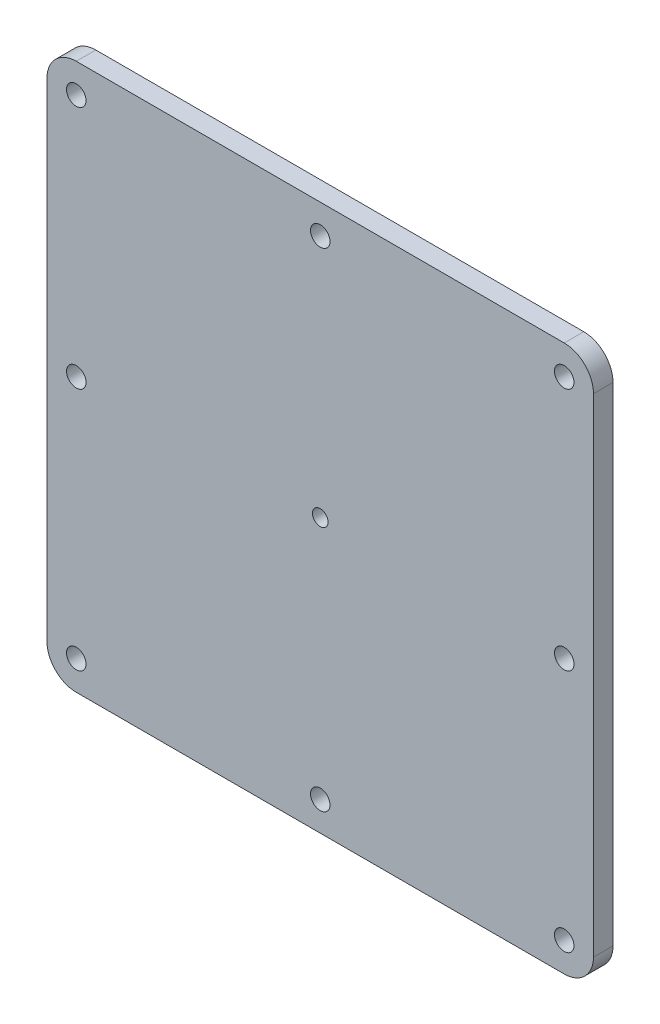
ISO-10303-21;
HEADER;
FILE_DESCRIPTION(('STEP AP214'),'2;1');
FILE_NAME('part.step','',(''),(''),'','','');
FILE_SCHEMA(('AUTOMOTIVE_DESIGN { 1 0 10303 214 1 1 1 1 }'));
ENDSEC;
DATA;
#1=APPLICATION_CONTEXT('core data for automotive mechanical design processes');
#2=APPLICATION_PROTOCOL_DEFINITION('international standard','automotive_design',2000,#1);
#3=PRODUCT_CONTEXT('',#1,'mechanical');
#4=PRODUCT('Part','Part','',(#3));
#5=PRODUCT_RELATED_PRODUCT_CATEGORY('part','',(#4));
#6=PRODUCT_DEFINITION_FORMATION('','',#4);
#7=PRODUCT_DEFINITION_CONTEXT('part definition',#1,'design');
#8=PRODUCT_DEFINITION('design','',#6,#7);
#9=PRODUCT_DEFINITION_SHAPE('','',#8);
#10=(LENGTH_UNIT() NAMED_UNIT(*) SI_UNIT(.MILLI.,.METRE.));
#11=(NAMED_UNIT(*) PLANE_ANGLE_UNIT() SI_UNIT($,.RADIAN.));
#12=(NAMED_UNIT(*) SI_UNIT($,.STERADIAN.) SOLID_ANGLE_UNIT());
#13=UNCERTAINTY_MEASURE_WITH_UNIT(LENGTH_MEASURE(1.E-05),#10,'distance_accuracy_value','');
#14=(GEOMETRIC_REPRESENTATION_CONTEXT(3) GLOBAL_UNCERTAINTY_ASSIGNED_CONTEXT((#13)) GLOBAL_UNIT_ASSIGNED_CONTEXT((#10,
#11,#12)) REPRESENTATION_CONTEXT('',''));
#15=CARTESIAN_POINT('',(0.,0.,0.));
#16=DIRECTION('',(0.,0.,1.));
#17=DIRECTION('',(1.,0.,0.));
#18=AXIS2_PLACEMENT_3D('',#15,#16,#17);
#19=CARTESIAN_POINT('',(-125.,-125.,10.));
#20=DIRECTION('',(0.,0.,1.));
#21=DIRECTION('',(1.,0.,0.));
#22=AXIS2_PLACEMENT_3D('',#19,#20,#21);
#23=PLANE('',#22);
#24=CARTESIAN_POINT('',(0.,-125.,10.));
#25=DIRECTION('',(0.,0.,1.));
#26=DIRECTION('',(1.,0.,0.));
#27=AXIS2_PLACEMENT_3D('',#24,#25,#26);
#28=CIRCLE('',#27,5.);
#29=CARTESIAN_POINT('',(5.,-125.,10.));
#30=VERTEX_POINT('',#29);
#31=EDGE_CURVE('E218',#30,#30,#28,.T.);
#32=ORIENTED_EDGE('',*,*,#31,.F.);
#33=EDGE_LOOP('',(#32));
#34=FACE_BOUND('',#33,.T.);
#35=CARTESIAN_POINT('',(0.,0.,10.));
#36=DIRECTION('',(0.,0.,1.));
#37=DIRECTION('',(1.,0.,0.));
#38=AXIS2_PLACEMENT_3D('',#35,#36,#37);
#39=CIRCLE('',#38,4.);
#40=CARTESIAN_POINT('',(4.,0.,10.));
#41=VERTEX_POINT('',#40);
#42=EDGE_CURVE('E206',#41,#41,#39,.T.);
#43=ORIENTED_EDGE('',*,*,#42,.F.);
#44=EDGE_LOOP('',(#43));
#45=FACE_BOUND('',#44,.T.);
#46=CARTESIAN_POINT('',(125.,0.,10.));
#47=DIRECTION('',(0.,0.,1.));
#48=DIRECTION('',(1.,0.,0.));
#49=AXIS2_PLACEMENT_3D('',#46,#47,#48);
#50=CIRCLE('',#49,5.00000000000001);
#51=CARTESIAN_POINT('',(130.,0.,10.));
#52=VERTEX_POINT('',#51);
#53=EDGE_CURVE('E194',#52,#52,#50,.T.);
#54=ORIENTED_EDGE('',*,*,#53,.F.);
#55=EDGE_LOOP('',(#54));
#56=FACE_BOUND('',#55,.T.);
#57=CARTESIAN_POINT('',(0.,125.,10.));
#58=DIRECTION('',(0.,0.,1.));
#59=DIRECTION('',(1.,0.,0.));
#60=AXIS2_PLACEMENT_3D('',#57,#58,#59);
#61=CIRCLE('',#60,5.);
#62=CARTESIAN_POINT('',(4.99999999999999,125.,10.));
#63=VERTEX_POINT('',#62);
#64=EDGE_CURVE('E182',#63,#63,#61,.T.);
#65=ORIENTED_EDGE('',*,*,#64,.F.);
#66=EDGE_LOOP('',(#65));
#67=FACE_BOUND('',#66,.T.);
#68=CARTESIAN_POINT('',(-125.,-125.,10.));
#69=DIRECTION('',(0.,0.,1.));
#70=DIRECTION('',(1.,0.,0.));
#71=AXIS2_PLACEMENT_3D('',#68,#69,#70);
#72=CIRCLE('',#71,15.);
#73=CARTESIAN_POINT('',(-140.,-125.,10.));
#74=VERTEX_POINT('',#73);
#75=CARTESIAN_POINT('',(-125.,-140.,10.));
#76=VERTEX_POINT('',#75);
#77=EDGE_CURVE('E145',#74,#76,#72,.T.);
#78=ORIENTED_EDGE('',*,*,#77,.T.);
#79=DIRECTION('',(1.,0.,0.));
#80=VECTOR('',#79,1.);
#81=CARTESIAN_POINT('',(-125.,-140.,10.));
#82=LINE('',#81,#80);
#83=CARTESIAN_POINT('',(125.,-140.,10.));
#84=VERTEX_POINT('',#83);
#85=EDGE_CURVE('E93',#76,#84,#82,.T.);
#86=ORIENTED_EDGE('',*,*,#85,.T.);
#87=CARTESIAN_POINT('',(125.,-125.,10.));
#88=DIRECTION('',(0.,0.,1.));
#89=DIRECTION('',(1.,0.,0.));
#90=AXIS2_PLACEMENT_3D('',#87,#88,#89);
#91=CIRCLE('',#90,15.);
#92=CARTESIAN_POINT('',(140.,-125.,10.));
#93=VERTEX_POINT('',#92);
#94=EDGE_CURVE('E160',#84,#93,#91,.T.);
#95=ORIENTED_EDGE('',*,*,#94,.T.);
#96=DIRECTION('',(0.,1.,0.));
#97=VECTOR('',#96,1.);
#98=CARTESIAN_POINT('',(140.,125.,10.));
#99=LINE('',#98,#97);
#100=CARTESIAN_POINT('',(140.,125.,10.));
#101=VERTEX_POINT('',#100);
#102=EDGE_CURVE('E173',#93,#101,#99,.T.);
#103=ORIENTED_EDGE('',*,*,#102,.T.);
#104=CARTESIAN_POINT('',(125.,125.,10.));
#105=DIRECTION('',(0.,0.,1.));
#106=DIRECTION('',(-1.,0.,0.));
#107=AXIS2_PLACEMENT_3D('',#104,#105,#106);
#108=CIRCLE('',#107,15.);
#109=CARTESIAN_POINT('',(125.,140.,10.));
#110=VERTEX_POINT('',#109);
#111=EDGE_CURVE('E112',#101,#110,#108,.T.);
#112=ORIENTED_EDGE('',*,*,#111,.T.);
#113=DIRECTION('',(-1.,0.,0.));
#114=VECTOR('',#113,1.);
#115=CARTESIAN_POINT('',(-125.,140.,10.));
#116=LINE('',#115,#114);
#117=CARTESIAN_POINT('',(-125.,140.,10.));
#118=VERTEX_POINT('',#117);
#119=EDGE_CURVE('E106',#110,#118,#116,.T.);
#120=ORIENTED_EDGE('',*,*,#119,.T.);
#121=CARTESIAN_POINT('',(-125.,125.,10.));
#122=DIRECTION('',(0.,0.,1.));
#123=DIRECTION('',(1.,0.,0.));
#124=AXIS2_PLACEMENT_3D('',#121,#122,#123);
#125=CIRCLE('',#124,15.);
#126=CARTESIAN_POINT('',(-140.,125.,10.));
#127=VERTEX_POINT('',#126);
#128=EDGE_CURVE('E110',#118,#127,#125,.T.);
#129=ORIENTED_EDGE('',*,*,#128,.T.);
#130=DIRECTION('',(0.,-1.,0.));
#131=VECTOR('',#130,1.);
#132=CARTESIAN_POINT('',(-140.,125.,10.));
#133=LINE('',#132,#131);
#134=EDGE_CURVE('E50',#127,#74,#133,.T.);
#135=ORIENTED_EDGE('',*,*,#134,.T.);
#136=EDGE_LOOP('',(#78,#86,#95,#103,#112,#120,#129,#135));
#137=FACE_BOUND('',#136,.T.);
#138=CARTESIAN_POINT('',(-125.,125.,10.));
#139=DIRECTION('',(0.,0.,1.));
#140=DIRECTION('',(1.,0.,0.));
#141=AXIS2_PLACEMENT_3D('',#138,#139,#140);
#142=CIRCLE('',#141,5.00000000000001);
#143=CARTESIAN_POINT('',(-120.,125.,10.));
#144=VERTEX_POINT('',#143);
#145=EDGE_CURVE('E134',#144,#144,#142,.T.);
#146=ORIENTED_EDGE('',*,*,#145,.F.);
#147=EDGE_LOOP('',(#146));
#148=FACE_BOUND('',#147,.T.);
#149=CARTESIAN_POINT('',(125.,125.,10.));
#150=DIRECTION('',(0.,0.,1.));
#151=DIRECTION('',(1.,0.,0.));
#152=AXIS2_PLACEMENT_3D('',#149,#150,#151);
#153=CIRCLE('',#152,4.99999999999999);
#154=CARTESIAN_POINT('',(130.,125.,10.));
#155=VERTEX_POINT('',#154);
#156=EDGE_CURVE('E188',#155,#155,#153,.T.);
#157=ORIENTED_EDGE('',*,*,#156,.F.);
#158=EDGE_LOOP('',(#157));
#159=FACE_BOUND('',#158,.T.);
#160=CARTESIAN_POINT('',(-125.,0.,10.));
#161=DIRECTION('',(0.,0.,1.));
#162=DIRECTION('',(1.,0.,0.));
#163=AXIS2_PLACEMENT_3D('',#160,#161,#162);
#164=CIRCLE('',#163,5.);
#165=CARTESIAN_POINT('',(-120.,0.,10.));
#166=VERTEX_POINT('',#165);
#167=EDGE_CURVE('E200',#166,#166,#164,.T.);
#168=ORIENTED_EDGE('',*,*,#167,.F.);
#169=EDGE_LOOP('',(#168));
#170=FACE_BOUND('',#169,.T.);
#171=CARTESIAN_POINT('',(-125.,-125.,10.));
#172=DIRECTION('',(0.,0.,1.));
#173=DIRECTION('',(1.,0.,0.));
#174=AXIS2_PLACEMENT_3D('',#171,#172,#173);
#175=CIRCLE('',#174,5.00000000000001);
#176=CARTESIAN_POINT('',(-120.,-125.,10.));
#177=VERTEX_POINT('',#176);
#178=EDGE_CURVE('E212',#177,#177,#175,.T.);
#179=ORIENTED_EDGE('',*,*,#178,.F.);
#180=EDGE_LOOP('',(#179));
#181=FACE_BOUND('',#180,.T.);
#182=CARTESIAN_POINT('',(125.,-125.,10.));
#183=DIRECTION('',(0.,0.,1.));
#184=DIRECTION('',(1.,0.,0.));
#185=AXIS2_PLACEMENT_3D('',#182,#183,#184);
#186=CIRCLE('',#185,5.00000000000002);
#187=CARTESIAN_POINT('',(130.,-125.,10.));
#188=VERTEX_POINT('',#187);
#189=EDGE_CURVE('E224',#188,#188,#186,.T.);
#190=ORIENTED_EDGE('',*,*,#189,.F.);
#191=EDGE_LOOP('',(#190));
#192=FACE_BOUND('',#191,.T.);
#193=ADVANCED_FACE('F33',(#34,#45,#56,#67,#137,#148,#159,#170,#181,#192),#23,.T.);
#194=CARTESIAN_POINT('',(-125.,-125.,0.));
#195=DIRECTION('',(0.,0.,1.));
#196=DIRECTION('',(1.,0.,0.));
#197=AXIS2_PLACEMENT_3D('',#194,#195,#196);
#198=PLANE('',#197);
#199=CARTESIAN_POINT('',(-125.,-125.,0.));
#200=DIRECTION('',(0.,0.,1.));
#201=DIRECTION('',(1.,0.,0.));
#202=AXIS2_PLACEMENT_3D('',#199,#200,#201);
#203=CIRCLE('',#202,15.);
#204=CARTESIAN_POINT('',(-140.,-125.,0.));
#205=VERTEX_POINT('',#204);
#206=CARTESIAN_POINT('',(-125.,-140.,0.));
#207=VERTEX_POINT('',#206);
#208=EDGE_CURVE('E130',#205,#207,#203,.T.);
#209=ORIENTED_EDGE('',*,*,#208,.F.);
#210=DIRECTION('',(0.,-1.,0.));
#211=VECTOR('',#210,1.);
#212=CARTESIAN_POINT('',(-140.,125.,0.));
#213=LINE('',#212,#211);
#214=CARTESIAN_POINT('',(-140.,125.,0.));
#215=VERTEX_POINT('',#214);
#216=EDGE_CURVE('E85',#215,#205,#213,.T.);
#217=ORIENTED_EDGE('',*,*,#216,.F.);
#218=CARTESIAN_POINT('',(-125.,125.,0.));
#219=DIRECTION('',(0.,0.,1.));
#220=DIRECTION('',(1.,0.,0.));
#221=AXIS2_PLACEMENT_3D('',#218,#219,#220);
#222=CIRCLE('',#221,15.);
#223=CARTESIAN_POINT('',(-125.,140.,0.));
#224=VERTEX_POINT('',#223);
#225=EDGE_CURVE('E79',#224,#215,#222,.T.);
#226=ORIENTED_EDGE('',*,*,#225,.F.);
#227=DIRECTION('',(-1.,0.,0.));
#228=VECTOR('',#227,1.);
#229=CARTESIAN_POINT('',(-125.,140.,0.));
#230=LINE('',#229,#228);
#231=CARTESIAN_POINT('',(125.,140.,0.));
#232=VERTEX_POINT('',#231);
#233=EDGE_CURVE('E120',#232,#224,#230,.T.);
#234=ORIENTED_EDGE('',*,*,#233,.F.);
#235=CARTESIAN_POINT('',(125.,125.,0.));
#236=DIRECTION('',(0.,0.,1.));
#237=DIRECTION('',(-1.,0.,0.));
#238=AXIS2_PLACEMENT_3D('',#235,#236,#237);
#239=CIRCLE('',#238,15.);
#240=CARTESIAN_POINT('',(140.,125.,0.));
#241=VERTEX_POINT('',#240);
#242=EDGE_CURVE('E140',#241,#232,#239,.T.);
#243=ORIENTED_EDGE('',*,*,#242,.F.);
#244=DIRECTION('',(0.,1.,0.));
#245=VECTOR('',#244,1.);
#246=CARTESIAN_POINT('',(140.,125.,0.));
#247=LINE('',#246,#245);
#248=CARTESIAN_POINT('',(140.,-125.,0.));
#249=VERTEX_POINT('',#248);
#250=EDGE_CURVE('E138',#249,#241,#247,.T.);
#251=ORIENTED_EDGE('',*,*,#250,.F.);
#252=CARTESIAN_POINT('',(125.,-125.,0.));
#253=DIRECTION('',(0.,0.,1.));
#254=DIRECTION('',(1.,0.,0.));
#255=AXIS2_PLACEMENT_3D('',#252,#253,#254);
#256=CIRCLE('',#255,15.);
#257=CARTESIAN_POINT('',(125.,-140.,0.));
#258=VERTEX_POINT('',#257);
#259=EDGE_CURVE('E136',#258,#249,#256,.T.);
#260=ORIENTED_EDGE('',*,*,#259,.F.);
#261=DIRECTION('',(1.,0.,0.));
#262=VECTOR('',#261,1.);
#263=CARTESIAN_POINT('',(-125.,-140.,0.));
#264=LINE('',#263,#262);
#265=EDGE_CURVE('E133',#207,#258,#264,.T.);
#266=ORIENTED_EDGE('',*,*,#265,.F.);
#267=EDGE_LOOP('',(#209,#217,#226,#234,#243,#251,#260,#266));
#268=FACE_BOUND('',#267,.T.);
#269=CARTESIAN_POINT('',(-125.,125.,0.));
#270=DIRECTION('',(0.,0.,1.));
#271=DIRECTION('',(1.,0.,0.));
#272=AXIS2_PLACEMENT_3D('',#269,#270,#271);
#273=CIRCLE('',#272,5.00000000000001);
#274=CARTESIAN_POINT('',(-120.,125.,0.));
#275=VERTEX_POINT('',#274);
#276=EDGE_CURVE('E179',#275,#275,#273,.T.);
#277=ORIENTED_EDGE('',*,*,#276,.T.);
#278=EDGE_LOOP('',(#277));
#279=FACE_BOUND('',#278,.T.);
#280=CARTESIAN_POINT('',(0.,125.,0.));
#281=DIRECTION('',(0.,0.,1.));
#282=DIRECTION('',(1.,0.,0.));
#283=AXIS2_PLACEMENT_3D('',#280,#281,#282);
#284=CIRCLE('',#283,5.);
#285=CARTESIAN_POINT('',(4.99999999999999,125.,0.));
#286=VERTEX_POINT('',#285);
#287=EDGE_CURVE('E185',#286,#286,#284,.T.);
#288=ORIENTED_EDGE('',*,*,#287,.T.);
#289=EDGE_LOOP('',(#288));
#290=FACE_BOUND('',#289,.T.);
#291=CARTESIAN_POINT('',(125.,125.,0.));
#292=DIRECTION('',(0.,0.,1.));
#293=DIRECTION('',(1.,0.,0.));
#294=AXIS2_PLACEMENT_3D('',#291,#292,#293);
#295=CIRCLE('',#294,4.99999999999999);
#296=CARTESIAN_POINT('',(130.,125.,0.));
#297=VERTEX_POINT('',#296);
#298=EDGE_CURVE('E191',#297,#297,#295,.T.);
#299=ORIENTED_EDGE('',*,*,#298,.T.);
#300=EDGE_LOOP('',(#299));
#301=FACE_BOUND('',#300,.T.);
#302=CARTESIAN_POINT('',(125.,0.,0.));
#303=DIRECTION('',(0.,0.,1.));
#304=DIRECTION('',(1.,0.,0.));
#305=AXIS2_PLACEMENT_3D('',#302,#303,#304);
#306=CIRCLE('',#305,5.00000000000001);
#307=CARTESIAN_POINT('',(130.,0.,0.));
#308=VERTEX_POINT('',#307);
#309=EDGE_CURVE('E197',#308,#308,#306,.T.);
#310=ORIENTED_EDGE('',*,*,#309,.T.);
#311=EDGE_LOOP('',(#310));
#312=FACE_BOUND('',#311,.T.);
#313=CARTESIAN_POINT('',(-125.,0.,0.));
#314=DIRECTION('',(0.,0.,1.));
#315=DIRECTION('',(1.,0.,0.));
#316=AXIS2_PLACEMENT_3D('',#313,#314,#315);
#317=CIRCLE('',#316,5.);
#318=CARTESIAN_POINT('',(-120.,0.,0.));
#319=VERTEX_POINT('',#318);
#320=EDGE_CURVE('E203',#319,#319,#317,.T.);
#321=ORIENTED_EDGE('',*,*,#320,.T.);
#322=EDGE_LOOP('',(#321));
#323=FACE_BOUND('',#322,.T.);
#324=CARTESIAN_POINT('',(0.,0.,0.));
#325=DIRECTION('',(0.,0.,1.));
#326=DIRECTION('',(1.,0.,0.));
#327=AXIS2_PLACEMENT_3D('',#324,#325,#326);
#328=CIRCLE('',#327,4.);
#329=CARTESIAN_POINT('',(4.,0.,0.));
#330=VERTEX_POINT('',#329);
#331=EDGE_CURVE('E209',#330,#330,#328,.T.);
#332=ORIENTED_EDGE('',*,*,#331,.T.);
#333=EDGE_LOOP('',(#332));
#334=FACE_BOUND('',#333,.T.);
#335=CARTESIAN_POINT('',(-125.,-125.,0.));
#336=DIRECTION('',(0.,0.,1.));
#337=DIRECTION('',(1.,0.,0.));
#338=AXIS2_PLACEMENT_3D('',#335,#336,#337);
#339=CIRCLE('',#338,5.00000000000001);
#340=CARTESIAN_POINT('',(-120.,-125.,0.));
#341=VERTEX_POINT('',#340);
#342=EDGE_CURVE('E215',#341,#341,#339,.T.);
#343=ORIENTED_EDGE('',*,*,#342,.T.);
#344=EDGE_LOOP('',(#343));
#345=FACE_BOUND('',#344,.T.);
#346=CARTESIAN_POINT('',(0.,-125.,0.));
#347=DIRECTION('',(0.,0.,1.));
#348=DIRECTION('',(1.,0.,0.));
#349=AXIS2_PLACEMENT_3D('',#346,#347,#348);
#350=CIRCLE('',#349,5.);
#351=CARTESIAN_POINT('',(5.,-125.,0.));
#352=VERTEX_POINT('',#351);
#353=EDGE_CURVE('E221',#352,#352,#350,.T.);
#354=ORIENTED_EDGE('',*,*,#353,.T.);
#355=EDGE_LOOP('',(#354));
#356=FACE_BOUND('',#355,.T.);
#357=CARTESIAN_POINT('',(125.,-125.,0.));
#358=DIRECTION('',(0.,0.,1.));
#359=DIRECTION('',(1.,0.,0.));
#360=AXIS2_PLACEMENT_3D('',#357,#358,#359);
#361=CIRCLE('',#360,5.00000000000002);
#362=CARTESIAN_POINT('',(130.,-125.,0.));
#363=VERTEX_POINT('',#362);
#364=EDGE_CURVE('E227',#363,#363,#361,.T.);
#365=ORIENTED_EDGE('',*,*,#364,.T.);
#366=EDGE_LOOP('',(#365));
#367=FACE_BOUND('',#366,.T.);
#368=ADVANCED_FACE('F164',(#268,#279,#290,#301,#312,#323,#334,#345,#356,#367),#198,.F.);
#369=CARTESIAN_POINT('',(-125.,-125.,10.));
#370=DIRECTION('',(0.,0.,-1.));
#371=DIRECTION('',(-1.,0.,0.));
#372=AXIS2_PLACEMENT_3D('',#369,#370,#371);
#373=CYLINDRICAL_SURFACE('',#372,15.);
#374=ORIENTED_EDGE('',*,*,#208,.T.);
#375=DIRECTION('',(0.,0.,-1.));
#376=VECTOR('',#375,1.);
#377=CARTESIAN_POINT('',(-125.,-140.,10.));
#378=LINE('',#377,#376);
#379=EDGE_CURVE('E11',#76,#207,#378,.T.);
#380=ORIENTED_EDGE('',*,*,#379,.F.);
#381=ORIENTED_EDGE('',*,*,#77,.F.);
#382=DIRECTION('',(0.,0.,-1.));
#383=VECTOR('',#382,1.);
#384=CARTESIAN_POINT('',(-140.,-125.,10.));
#385=LINE('',#384,#383);
#386=EDGE_CURVE('E126',#74,#205,#385,.T.);
#387=ORIENTED_EDGE('',*,*,#386,.T.);
#388=EDGE_LOOP('',(#374,#380,#381,#387));
#389=FACE_BOUND('',#388,.T.);
#390=ADVANCED_FACE('F35',(#389),#373,.T.);
#391=CARTESIAN_POINT('',(-125.,-140.,10.));
#392=DIRECTION('',(0.,1.,0.));
#393=DIRECTION('',(0.,0.,1.));
#394=AXIS2_PLACEMENT_3D('',#391,#392,#393);
#395=PLANE('',#394);
#396=ORIENTED_EDGE('',*,*,#265,.T.);
#397=DIRECTION('',(0.,0.,-1.));
#398=VECTOR('',#397,1.);
#399=CARTESIAN_POINT('',(125.,-140.,10.));
#400=LINE('',#399,#398);
#401=EDGE_CURVE('E42',#84,#258,#400,.T.);
#402=ORIENTED_EDGE('',*,*,#401,.F.);
#403=ORIENTED_EDGE('',*,*,#85,.F.);
#404=ORIENTED_EDGE('',*,*,#379,.T.);
#405=EDGE_LOOP('',(#396,#402,#403,#404));
#406=FACE_BOUND('',#405,.T.);
#407=ADVANCED_FACE('F261',(#406),#395,.F.);
#408=CARTESIAN_POINT('',(125.,-125.,10.));
#409=DIRECTION('',(0.,0.,-1.));
#410=DIRECTION('',(-1.,0.,0.));
#411=AXIS2_PLACEMENT_3D('',#408,#409,#410);
#412=CYLINDRICAL_SURFACE('',#411,15.);
#413=ORIENTED_EDGE('',*,*,#259,.T.);
#414=DIRECTION('',(0.,0.,-1.));
#415=VECTOR('',#414,1.);
#416=CARTESIAN_POINT('',(140.,-125.,10.));
#417=LINE('',#416,#415);
#418=EDGE_CURVE('E152',#93,#249,#417,.T.);
#419=ORIENTED_EDGE('',*,*,#418,.F.);
#420=ORIENTED_EDGE('',*,*,#94,.F.);
#421=ORIENTED_EDGE('',*,*,#401,.T.);
#422=EDGE_LOOP('',(#413,#419,#420,#421));
#423=FACE_BOUND('',#422,.T.);
#424=ADVANCED_FACE('F158',(#423),#412,.T.);
#425=CARTESIAN_POINT('',(140.,125.,10.));
#426=DIRECTION('',(-1.,0.,0.));
#427=DIRECTION('',(0.,0.,1.));
#428=AXIS2_PLACEMENT_3D('',#425,#426,#427);
#429=PLANE('',#428);
#430=ORIENTED_EDGE('',*,*,#250,.T.);
#431=DIRECTION('',(0.,0.,-1.));
#432=VECTOR('',#431,1.);
#433=CARTESIAN_POINT('',(140.,125.,10.));
#434=LINE('',#433,#432);
#435=EDGE_CURVE('E149',#101,#241,#434,.T.);
#436=ORIENTED_EDGE('',*,*,#435,.F.);
#437=ORIENTED_EDGE('',*,*,#102,.F.);
#438=ORIENTED_EDGE('',*,*,#418,.T.);
#439=EDGE_LOOP('',(#430,#436,#437,#438));
#440=FACE_BOUND('',#439,.T.);
#441=ADVANCED_FACE('F169',(#440),#429,.F.);
#442=CARTESIAN_POINT('',(125.,125.,10.));
#443=DIRECTION('',(0.,0.,-1.));
#444=DIRECTION('',(-1.,0.,0.));
#445=AXIS2_PLACEMENT_3D('',#442,#443,#444);
#446=CYLINDRICAL_SURFACE('',#445,15.);
#447=ORIENTED_EDGE('',*,*,#242,.T.);
#448=DIRECTION('',(0.,0.,-1.));
#449=VECTOR('',#448,1.);
#450=CARTESIAN_POINT('',(125.,140.,10.));
#451=LINE('',#450,#449);
#452=EDGE_CURVE('E121',#110,#232,#451,.T.);
#453=ORIENTED_EDGE('',*,*,#452,.F.);
#454=ORIENTED_EDGE('',*,*,#111,.F.);
#455=ORIENTED_EDGE('',*,*,#435,.T.);
#456=EDGE_LOOP('',(#447,#453,#454,#455));
#457=FACE_BOUND('',#456,.T.);
#458=ADVANCED_FACE('F172',(#457),#446,.T.);
#459=CARTESIAN_POINT('',(-125.,140.,10.));
#460=DIRECTION('',(0.,-1.,0.));
#461=DIRECTION('',(0.,0.,-1.));
#462=AXIS2_PLACEMENT_3D('',#459,#460,#461);
#463=PLANE('',#462);
#464=ORIENTED_EDGE('',*,*,#233,.T.);
#465=DIRECTION('',(0.,0.,-1.));
#466=VECTOR('',#465,1.);
#467=CARTESIAN_POINT('',(-125.,140.,10.));
#468=LINE('',#467,#466);
#469=EDGE_CURVE('E117',#118,#224,#468,.T.);
#470=ORIENTED_EDGE('',*,*,#469,.F.);
#471=ORIENTED_EDGE('',*,*,#119,.F.);
#472=ORIENTED_EDGE('',*,*,#452,.T.);
#473=EDGE_LOOP('',(#464,#470,#471,#472));
#474=FACE_BOUND('',#473,.T.);
#475=ADVANCED_FACE('F118',(#474),#463,.F.);
#476=CARTESIAN_POINT('',(-125.,125.,10.));
#477=DIRECTION('',(0.,0.,-1.));
#478=DIRECTION('',(-1.,0.,0.));
#479=AXIS2_PLACEMENT_3D('',#476,#477,#478);
#480=CYLINDRICAL_SURFACE('',#479,15.);
#481=ORIENTED_EDGE('',*,*,#225,.T.);
#482=DIRECTION('',(0.,0.,-1.));
#483=VECTOR('',#482,1.);
#484=CARTESIAN_POINT('',(-140.,125.,10.));
#485=LINE('',#484,#483);
#486=EDGE_CURVE('E122',#127,#215,#485,.T.);
#487=ORIENTED_EDGE('',*,*,#486,.F.);
#488=ORIENTED_EDGE('',*,*,#128,.F.);
#489=ORIENTED_EDGE('',*,*,#469,.T.);
#490=EDGE_LOOP('',(#481,#487,#488,#489));
#491=FACE_BOUND('',#490,.T.);
#492=ADVANCED_FACE('F124',(#491),#480,.T.);
#493=CARTESIAN_POINT('',(-140.,125.,10.));
#494=DIRECTION('',(1.,0.,0.));
#495=DIRECTION('',(0.,0.,-1.));
#496=AXIS2_PLACEMENT_3D('',#493,#494,#495);
#497=PLANE('',#496);
#498=ORIENTED_EDGE('',*,*,#216,.T.);
#499=ORIENTED_EDGE('',*,*,#386,.F.);
#500=ORIENTED_EDGE('',*,*,#134,.F.);
#501=ORIENTED_EDGE('',*,*,#486,.T.);
#502=EDGE_LOOP('',(#498,#499,#500,#501));
#503=FACE_BOUND('',#502,.T.);
#504=ADVANCED_FACE('F249',(#503),#497,.F.);
#505=CARTESIAN_POINT('',(-125.,125.,10.));
#506=DIRECTION('',(0.,0.,-1.));
#507=DIRECTION('',(-1.,0.,0.));
#508=AXIS2_PLACEMENT_3D('',#505,#506,#507);
#509=CYLINDRICAL_SURFACE('',#508,5.00000000000001);
#510=ORIENTED_EDGE('',*,*,#145,.T.);
#511=EDGE_LOOP('',(#510));
#512=FACE_BOUND('',#511,.T.);
#513=ORIENTED_EDGE('',*,*,#276,.F.);
#514=EDGE_LOOP('',(#513));
#515=FACE_BOUND('',#514,.T.);
#516=ADVANCED_FACE('F246',(#512,#515),#509,.F.);
#517=CARTESIAN_POINT('',(0.,125.,10.));
#518=DIRECTION('',(0.,0.,-1.));
#519=DIRECTION('',(-1.,0.,0.));
#520=AXIS2_PLACEMENT_3D('',#517,#518,#519);
#521=CYLINDRICAL_SURFACE('',#520,5.);
#522=ORIENTED_EDGE('',*,*,#64,.T.);
#523=EDGE_LOOP('',(#522));
#524=FACE_BOUND('',#523,.T.);
#525=ORIENTED_EDGE('',*,*,#287,.F.);
#526=EDGE_LOOP('',(#525));
#527=FACE_BOUND('',#526,.T.);
#528=ADVANCED_FACE('F325',(#524,#527),#521,.F.);
#529=CARTESIAN_POINT('',(125.,125.,10.));
#530=DIRECTION('',(0.,0.,-1.));
#531=DIRECTION('',(-1.,0.,0.));
#532=AXIS2_PLACEMENT_3D('',#529,#530,#531);
#533=CYLINDRICAL_SURFACE('',#532,4.99999999999999);
#534=ORIENTED_EDGE('',*,*,#156,.T.);
#535=EDGE_LOOP('',(#534));
#536=FACE_BOUND('',#535,.T.);
#537=ORIENTED_EDGE('',*,*,#298,.F.);
#538=EDGE_LOOP('',(#537));
#539=FACE_BOUND('',#538,.T.);
#540=ADVANCED_FACE('F333',(#536,#539),#533,.F.);
#541=CARTESIAN_POINT('',(125.,0.,10.));
#542=DIRECTION('',(0.,0.,-1.));
#543=DIRECTION('',(-1.,0.,0.));
#544=AXIS2_PLACEMENT_3D('',#541,#542,#543);
#545=CYLINDRICAL_SURFACE('',#544,5.00000000000001);
#546=ORIENTED_EDGE('',*,*,#53,.T.);
#547=EDGE_LOOP('',(#546));
#548=FACE_BOUND('',#547,.T.);
#549=ORIENTED_EDGE('',*,*,#309,.F.);
#550=EDGE_LOOP('',(#549));
#551=FACE_BOUND('',#550,.T.);
#552=ADVANCED_FACE('F341',(#548,#551),#545,.F.);
#553=CARTESIAN_POINT('',(-125.,0.,10.));
#554=DIRECTION('',(0.,0.,-1.));
#555=DIRECTION('',(-1.,0.,0.));
#556=AXIS2_PLACEMENT_3D('',#553,#554,#555);
#557=CYLINDRICAL_SURFACE('',#556,5.);
#558=ORIENTED_EDGE('',*,*,#167,.T.);
#559=EDGE_LOOP('',(#558));
#560=FACE_BOUND('',#559,.T.);
#561=ORIENTED_EDGE('',*,*,#320,.F.);
#562=EDGE_LOOP('',(#561));
#563=FACE_BOUND('',#562,.T.);
#564=ADVANCED_FACE('F350',(#560,#563),#557,.F.);
#565=CARTESIAN_POINT('',(0.,0.,10.));
#566=DIRECTION('',(0.,0.,-1.));
#567=DIRECTION('',(-1.,0.,0.));
#568=AXIS2_PLACEMENT_3D('',#565,#566,#567);
#569=CYLINDRICAL_SURFACE('',#568,4.);
#570=ORIENTED_EDGE('',*,*,#42,.T.);
#571=EDGE_LOOP('',(#570));
#572=FACE_BOUND('',#571,.T.);
#573=ORIENTED_EDGE('',*,*,#331,.F.);
#574=EDGE_LOOP('',(#573));
#575=FACE_BOUND('',#574,.T.);
#576=ADVANCED_FACE('F359',(#572,#575),#569,.F.);
#577=CARTESIAN_POINT('',(-125.,-125.,10.));
#578=DIRECTION('',(0.,0.,-1.));
#579=DIRECTION('',(-1.,0.,0.));
#580=AXIS2_PLACEMENT_3D('',#577,#578,#579);
#581=CYLINDRICAL_SURFACE('',#580,5.00000000000001);
#582=ORIENTED_EDGE('',*,*,#178,.T.);
#583=EDGE_LOOP('',(#582));
#584=FACE_BOUND('',#583,.T.);
#585=ORIENTED_EDGE('',*,*,#342,.F.);
#586=EDGE_LOOP('',(#585));
#587=FACE_BOUND('',#586,.T.);
#588=ADVANCED_FACE('F368',(#584,#587),#581,.F.);
#589=CARTESIAN_POINT('',(0.,-125.,10.));
#590=DIRECTION('',(0.,0.,-1.));
#591=DIRECTION('',(-1.,0.,0.));
#592=AXIS2_PLACEMENT_3D('',#589,#590,#591);
#593=CYLINDRICAL_SURFACE('',#592,5.);
#594=ORIENTED_EDGE('',*,*,#31,.T.);
#595=EDGE_LOOP('',(#594));
#596=FACE_BOUND('',#595,.T.);
#597=ORIENTED_EDGE('',*,*,#353,.F.);
#598=EDGE_LOOP('',(#597));
#599=FACE_BOUND('',#598,.T.);
#600=ADVANCED_FACE('F377',(#596,#599),#593,.F.);
#601=CARTESIAN_POINT('',(125.,-125.,10.));
#602=DIRECTION('',(0.,0.,-1.));
#603=DIRECTION('',(-1.,0.,0.));
#604=AXIS2_PLACEMENT_3D('',#601,#602,#603);
#605=CYLINDRICAL_SURFACE('',#604,5.00000000000002);
#606=ORIENTED_EDGE('',*,*,#189,.T.);
#607=EDGE_LOOP('',(#606));
#608=FACE_BOUND('',#607,.T.);
#609=ORIENTED_EDGE('',*,*,#364,.F.);
#610=EDGE_LOOP('',(#609));
#611=FACE_BOUND('',#610,.T.);
#612=ADVANCED_FACE('F233',(#608,#611),#605,.F.);
#613=CLOSED_SHELL('',(#193,#368,#390,#407,#424,#441,#458,#475,#492,#504,#516,#528,#540,#552,
#564,#576,#588,#600,#612));
#614=MANIFOLD_SOLID_BREP('B2',#613);
#615=ADVANCED_BREP_SHAPE_REPRESENTATION('',(#18,#614),#14);
#616=SHAPE_DEFINITION_REPRESENTATION(#9,#615);
ENDSEC;
END-ISO-10303-21;
